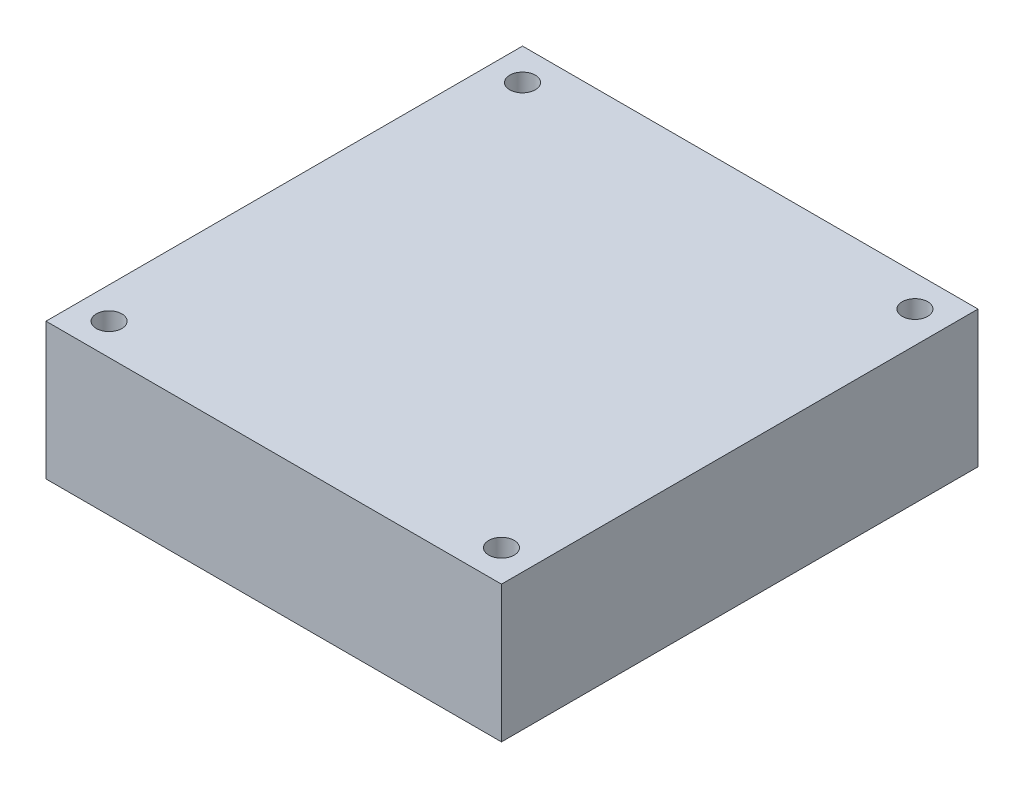
ISO-10303-21;
HEADER;
FILE_DESCRIPTION(('STEP AP214'),'2;1');
FILE_NAME('part.step','',(''),(''),'','','');
FILE_SCHEMA(('AUTOMOTIVE_DESIGN { 1 0 10303 214 1 1 1 1 }'));
ENDSEC;
DATA;
#1=APPLICATION_CONTEXT('core data for automotive mechanical design processes');
#2=APPLICATION_PROTOCOL_DEFINITION('international standard','automotive_design',2000,#1);
#3=PRODUCT_CONTEXT('',#1,'mechanical');
#4=PRODUCT('Part','Part','',(#3));
#5=PRODUCT_RELATED_PRODUCT_CATEGORY('part','',(#4));
#6=PRODUCT_DEFINITION_FORMATION('','',#4);
#7=PRODUCT_DEFINITION_CONTEXT('part definition',#1,'design');
#8=PRODUCT_DEFINITION('design','',#6,#7);
#9=PRODUCT_DEFINITION_SHAPE('','',#8);
#10=(LENGTH_UNIT() NAMED_UNIT(*) SI_UNIT(.MILLI.,.METRE.));
#11=(NAMED_UNIT(*) PLANE_ANGLE_UNIT() SI_UNIT($,.RADIAN.));
#12=(NAMED_UNIT(*) SI_UNIT($,.STERADIAN.) SOLID_ANGLE_UNIT());
#13=UNCERTAINTY_MEASURE_WITH_UNIT(LENGTH_MEASURE(1.E-05),#10,'distance_accuracy_value','');
#14=(GEOMETRIC_REPRESENTATION_CONTEXT(3) GLOBAL_UNCERTAINTY_ASSIGNED_CONTEXT((#13)) GLOBAL_UNIT_ASSIGNED_CONTEXT((#10,
#11,#12)) REPRESENTATION_CONTEXT('',''));
#15=CARTESIAN_POINT('',(0.,0.,0.));
#16=DIRECTION('',(0.,0.,1.));
#17=DIRECTION('',(1.,0.,0.));
#18=AXIS2_PLACEMENT_3D('',#15,#16,#17);
#19=CARTESIAN_POINT('',(32.5,19.5,-34.));
#20=DIRECTION('',(-1.,0.,0.));
#21=DIRECTION('',(0.,0.,1.));
#22=AXIS2_PLACEMENT_3D('',#19,#20,#21);
#23=PLANE('',#22);
#24=DIRECTION('',(0.,0.,-1.));
#25=VECTOR('',#24,1.);
#26=CARTESIAN_POINT('',(32.5,0.,-34.));
#27=LINE('',#26,#25);
#28=CARTESIAN_POINT('',(32.5,0.,34.));
#29=VERTEX_POINT('',#28);
#30=CARTESIAN_POINT('',(32.5,0.,-34.));
#31=VERTEX_POINT('',#30);
#32=EDGE_CURVE('E115',#29,#31,#27,.T.);
#33=ORIENTED_EDGE('',*,*,#32,.T.);
#34=DIRECTION('',(0.,-1.,0.));
#35=VECTOR('',#34,1.);
#36=CARTESIAN_POINT('',(32.5,19.5,-34.));
#37=LINE('',#36,#35);
#38=CARTESIAN_POINT('',(32.5,19.5,-34.));
#39=VERTEX_POINT('',#38);
#40=EDGE_CURVE('E11',#39,#31,#37,.T.);
#41=ORIENTED_EDGE('',*,*,#40,.F.);
#42=DIRECTION('',(0.,0.,-1.));
#43=VECTOR('',#42,1.);
#44=CARTESIAN_POINT('',(32.5,19.5,-34.));
#45=LINE('',#44,#43);
#46=CARTESIAN_POINT('',(32.5,19.5,34.));
#47=VERTEX_POINT('',#46);
#48=EDGE_CURVE('E99',#47,#39,#45,.T.);
#49=ORIENTED_EDGE('',*,*,#48,.F.);
#50=DIRECTION('',(0.,-1.,0.));
#51=VECTOR('',#50,1.);
#52=CARTESIAN_POINT('',(32.5,19.5,34.));
#53=LINE('',#52,#51);
#54=EDGE_CURVE('E111',#47,#29,#53,.T.);
#55=ORIENTED_EDGE('',*,*,#54,.T.);
#56=EDGE_LOOP('',(#33,#41,#49,#55));
#57=FACE_BOUND('',#56,.T.);
#58=ADVANCED_FACE('F47',(#57),#23,.F.);
#59=CARTESIAN_POINT('',(-32.5,19.5,-34.));
#60=DIRECTION('',(0.,0.,1.));
#61=DIRECTION('',(1.,0.,0.));
#62=AXIS2_PLACEMENT_3D('',#59,#60,#61);
#63=PLANE('',#62);
#64=DIRECTION('',(-1.,0.,0.));
#65=VECTOR('',#64,1.);
#66=CARTESIAN_POINT('',(-32.5,0.,-34.));
#67=LINE('',#66,#65);
#68=CARTESIAN_POINT('',(-32.5,0.,-34.));
#69=VERTEX_POINT('',#68);
#70=EDGE_CURVE('E104',#31,#69,#67,.T.);
#71=ORIENTED_EDGE('',*,*,#70,.T.);
#72=DIRECTION('',(0.,-1.,0.));
#73=VECTOR('',#72,1.);
#74=CARTESIAN_POINT('',(-32.5,19.5,-34.));
#75=LINE('',#74,#73);
#76=CARTESIAN_POINT('',(-32.5,19.5,-34.));
#77=VERTEX_POINT('',#76);
#78=EDGE_CURVE('E56',#77,#69,#75,.T.);
#79=ORIENTED_EDGE('',*,*,#78,.F.);
#80=DIRECTION('',(-1.,0.,0.));
#81=VECTOR('',#80,1.);
#82=CARTESIAN_POINT('',(-32.5,19.5,-34.));
#83=LINE('',#82,#81);
#84=EDGE_CURVE('E94',#39,#77,#83,.T.);
#85=ORIENTED_EDGE('',*,*,#84,.F.);
#86=ORIENTED_EDGE('',*,*,#40,.T.);
#87=EDGE_LOOP('',(#71,#79,#85,#86));
#88=FACE_BOUND('',#87,.T.);
#89=ADVANCED_FACE('F103',(#88),#63,.F.);
#90=CARTESIAN_POINT('',(-32.5,19.5,-34.));
#91=DIRECTION('',(1.,0.,0.));
#92=DIRECTION('',(0.,0.,-1.));
#93=AXIS2_PLACEMENT_3D('',#90,#91,#92);
#94=PLANE('',#93);
#95=DIRECTION('',(0.,0.,1.));
#96=VECTOR('',#95,1.);
#97=CARTESIAN_POINT('',(-32.5,0.,-34.));
#98=LINE('',#97,#96);
#99=CARTESIAN_POINT('',(-32.5,0.,34.));
#100=VERTEX_POINT('',#99);
#101=EDGE_CURVE('E81',#69,#100,#98,.T.);
#102=ORIENTED_EDGE('',*,*,#101,.T.);
#103=DIRECTION('',(0.,-1.,0.));
#104=VECTOR('',#103,1.);
#105=CARTESIAN_POINT('',(-32.5,19.5,34.));
#106=LINE('',#105,#104);
#107=CARTESIAN_POINT('',(-32.5,19.5,34.));
#108=VERTEX_POINT('',#107);
#109=EDGE_CURVE('E106',#108,#100,#106,.T.);
#110=ORIENTED_EDGE('',*,*,#109,.F.);
#111=DIRECTION('',(0.,0.,1.));
#112=VECTOR('',#111,1.);
#113=CARTESIAN_POINT('',(-32.5,19.5,-34.));
#114=LINE('',#113,#112);
#115=EDGE_CURVE('E97',#77,#108,#114,.T.);
#116=ORIENTED_EDGE('',*,*,#115,.F.);
#117=ORIENTED_EDGE('',*,*,#78,.T.);
#118=EDGE_LOOP('',(#102,#110,#116,#117));
#119=FACE_BOUND('',#118,.T.);
#120=ADVANCED_FACE('F107',(#119),#94,.F.);
#121=CARTESIAN_POINT('',(-32.5,19.5,34.));
#122=DIRECTION('',(0.,0.,-1.));
#123=DIRECTION('',(-1.,0.,0.));
#124=AXIS2_PLACEMENT_3D('',#121,#122,#123);
#125=PLANE('',#124);
#126=DIRECTION('',(1.,0.,0.));
#127=VECTOR('',#126,1.);
#128=CARTESIAN_POINT('',(-32.5,0.,34.));
#129=LINE('',#128,#127);
#130=EDGE_CURVE('E87',#100,#29,#129,.T.);
#131=ORIENTED_EDGE('',*,*,#130,.T.);
#132=ORIENTED_EDGE('',*,*,#54,.F.);
#133=DIRECTION('',(1.,0.,0.));
#134=VECTOR('',#133,1.);
#135=CARTESIAN_POINT('',(-32.5,19.5,34.));
#136=LINE('',#135,#134);
#137=EDGE_CURVE('E64',#108,#47,#136,.T.);
#138=ORIENTED_EDGE('',*,*,#137,.F.);
#139=ORIENTED_EDGE('',*,*,#109,.T.);
#140=EDGE_LOOP('',(#131,#132,#138,#139));
#141=FACE_BOUND('',#140,.T.);
#142=ADVANCED_FACE('F129',(#141),#125,.F.);
#143=CARTESIAN_POINT('',(0.,19.5,0.));
#144=DIRECTION('',(0.,1.,0.));
#145=DIRECTION('',(0.,0.,1.));
#146=AXIS2_PLACEMENT_3D('',#143,#144,#145);
#147=PLANE('',#146);
#148=CARTESIAN_POINT('',(-28.,19.5,29.5));
#149=DIRECTION('',(0.,1.,0.));
#150=DIRECTION('',(0.,0.,-1.));
#151=AXIS2_PLACEMENT_3D('',#148,#149,#150);
#152=CIRCLE('',#151,1.81972227692951);
#153=CARTESIAN_POINT('',(-28.,19.5,27.6802777230705));
#154=VERTEX_POINT('',#153);
#155=EDGE_CURVE('E140',#154,#154,#152,.T.);
#156=ORIENTED_EDGE('',*,*,#155,.F.);
#157=EDGE_LOOP('',(#156));
#158=FACE_BOUND('',#157,.T.);
#159=CARTESIAN_POINT('',(28.,19.5,-29.5));
#160=DIRECTION('',(0.,1.,0.));
#161=DIRECTION('',(0.,0.,-1.));
#162=AXIS2_PLACEMENT_3D('',#159,#160,#161);
#163=CIRCLE('',#162,1.81972227692951);
#164=CARTESIAN_POINT('',(28.,19.5,-31.3197222769295));
#165=VERTEX_POINT('',#164);
#166=EDGE_CURVE('E148',#165,#165,#163,.T.);
#167=ORIENTED_EDGE('',*,*,#166,.F.);
#168=EDGE_LOOP('',(#167));
#169=FACE_BOUND('',#168,.T.);
#170=CARTESIAN_POINT('',(-28.,19.5,-29.5));
#171=DIRECTION('',(0.,1.,0.));
#172=DIRECTION('',(0.,0.,1.));
#173=AXIS2_PLACEMENT_3D('',#170,#171,#172);
#174=CIRCLE('',#173,1.81972227692951);
#175=CARTESIAN_POINT('',(-28.,19.5,-27.6802777230705));
#176=VERTEX_POINT('',#175);
#177=EDGE_CURVE('E149',#176,#176,#174,.T.);
#178=ORIENTED_EDGE('',*,*,#177,.F.);
#179=EDGE_LOOP('',(#178));
#180=FACE_BOUND('',#179,.T.);
#181=CARTESIAN_POINT('',(28.,19.5,29.5));
#182=DIRECTION('',(0.,1.,0.));
#183=DIRECTION('',(0.,0.,1.));
#184=AXIS2_PLACEMENT_3D('',#181,#182,#183);
#185=CIRCLE('',#184,1.81972227692951);
#186=CARTESIAN_POINT('',(28.,19.5,31.3197222769295));
#187=VERTEX_POINT('',#186);
#188=EDGE_CURVE('E136',#187,#187,#185,.T.);
#189=ORIENTED_EDGE('',*,*,#188,.F.);
#190=EDGE_LOOP('',(#189));
#191=FACE_BOUND('',#190,.T.);
#192=ORIENTED_EDGE('',*,*,#48,.T.);
#193=ORIENTED_EDGE('',*,*,#84,.T.);
#194=ORIENTED_EDGE('',*,*,#115,.T.);
#195=ORIENTED_EDGE('',*,*,#137,.T.);
#196=EDGE_LOOP('',(#192,#193,#194,#195));
#197=FACE_BOUND('',#196,.T.);
#198=ADVANCED_FACE('F95',(#158,#169,#180,#191,#197),#147,.T.);
#199=CARTESIAN_POINT('',(0.,0.,0.));
#200=DIRECTION('',(0.,1.,0.));
#201=DIRECTION('',(0.,0.,1.));
#202=AXIS2_PLACEMENT_3D('',#199,#200,#201);
#203=PLANE('',#202);
#204=CARTESIAN_POINT('',(-28.,0.,29.5));
#205=DIRECTION('',(0.,1.,0.));
#206=DIRECTION('',(0.,0.,-1.));
#207=AXIS2_PLACEMENT_3D('',#204,#205,#206);
#208=CIRCLE('',#207,1.81972227692951);
#209=CARTESIAN_POINT('',(-28.,0.,27.6802777230705));
#210=VERTEX_POINT('',#209);
#211=EDGE_CURVE('E153',#210,#210,#208,.T.);
#212=ORIENTED_EDGE('',*,*,#211,.T.);
#213=EDGE_LOOP('',(#212));
#214=FACE_BOUND('',#213,.T.);
#215=CARTESIAN_POINT('',(28.,0.,-29.5));
#216=DIRECTION('',(0.,1.,0.));
#217=DIRECTION('',(0.,0.,-1.));
#218=AXIS2_PLACEMENT_3D('',#215,#216,#217);
#219=CIRCLE('',#218,1.81972227692951);
#220=CARTESIAN_POINT('',(28.,0.,-31.3197222769295));
#221=VERTEX_POINT('',#220);
#222=EDGE_CURVE('E144',#221,#221,#219,.T.);
#223=ORIENTED_EDGE('',*,*,#222,.T.);
#224=EDGE_LOOP('',(#223));
#225=FACE_BOUND('',#224,.T.);
#226=CARTESIAN_POINT('',(-28.,0.,-29.5));
#227=DIRECTION('',(0.,1.,0.));
#228=DIRECTION('',(0.,0.,1.));
#229=AXIS2_PLACEMENT_3D('',#226,#227,#228);
#230=CIRCLE('',#229,1.81972227692951);
#231=CARTESIAN_POINT('',(-28.,0.,-27.6802777230705));
#232=VERTEX_POINT('',#231);
#233=EDGE_CURVE('E160',#232,#232,#230,.T.);
#234=ORIENTED_EDGE('',*,*,#233,.T.);
#235=EDGE_LOOP('',(#234));
#236=FACE_BOUND('',#235,.T.);
#237=CARTESIAN_POINT('',(28.,0.,29.5));
#238=DIRECTION('',(0.,1.,0.));
#239=DIRECTION('',(0.,0.,1.));
#240=AXIS2_PLACEMENT_3D('',#237,#238,#239);
#241=CIRCLE('',#240,1.81972227692951);
#242=CARTESIAN_POINT('',(28.,0.,31.3197222769295));
#243=VERTEX_POINT('',#242);
#244=EDGE_CURVE('E119',#243,#243,#241,.T.);
#245=ORIENTED_EDGE('',*,*,#244,.T.);
#246=EDGE_LOOP('',(#245));
#247=FACE_BOUND('',#246,.T.);
#248=ORIENTED_EDGE('',*,*,#32,.F.);
#249=ORIENTED_EDGE('',*,*,#130,.F.);
#250=ORIENTED_EDGE('',*,*,#101,.F.);
#251=ORIENTED_EDGE('',*,*,#70,.F.);
#252=EDGE_LOOP('',(#248,#249,#250,#251));
#253=FACE_BOUND('',#252,.T.);
#254=ADVANCED_FACE('F132',(#214,#225,#236,#247,#253),#203,.F.);
#255=CARTESIAN_POINT('',(28.,0.,29.5));
#256=DIRECTION('',(0.,1.,0.));
#257=DIRECTION('',(0.,0.,1.));
#258=AXIS2_PLACEMENT_3D('',#255,#256,#257);
#259=CYLINDRICAL_SURFACE('',#258,1.81972227692951);
#260=ORIENTED_EDGE('',*,*,#244,.F.);
#261=EDGE_LOOP('',(#260));
#262=FACE_BOUND('',#261,.T.);
#263=ORIENTED_EDGE('',*,*,#188,.T.);
#264=EDGE_LOOP('',(#263));
#265=FACE_BOUND('',#264,.T.);
#266=ADVANCED_FACE('F176',(#262,#265),#259,.F.);
#267=CARTESIAN_POINT('',(-28.,0.,-29.5));
#268=DIRECTION('',(0.,1.,0.));
#269=DIRECTION('',(0.,0.,1.));
#270=AXIS2_PLACEMENT_3D('',#267,#268,#269);
#271=CYLINDRICAL_SURFACE('',#270,1.81972227692951);
#272=ORIENTED_EDGE('',*,*,#233,.F.);
#273=EDGE_LOOP('',(#272));
#274=FACE_BOUND('',#273,.T.);
#275=ORIENTED_EDGE('',*,*,#177,.T.);
#276=EDGE_LOOP('',(#275));
#277=FACE_BOUND('',#276,.T.);
#278=ADVANCED_FACE('F168',(#274,#277),#271,.F.);
#279=CARTESIAN_POINT('',(28.,0.,-29.5));
#280=DIRECTION('',(0.,1.,0.));
#281=DIRECTION('',(0.,0.,1.));
#282=AXIS2_PLACEMENT_3D('',#279,#280,#281);
#283=CYLINDRICAL_SURFACE('',#282,1.81972227692951);
#284=ORIENTED_EDGE('',*,*,#222,.F.);
#285=EDGE_LOOP('',(#284));
#286=FACE_BOUND('',#285,.T.);
#287=ORIENTED_EDGE('',*,*,#166,.T.);
#288=EDGE_LOOP('',(#287));
#289=FACE_BOUND('',#288,.T.);
#290=ADVANCED_FACE('F184',(#286,#289),#283,.F.);
#291=CARTESIAN_POINT('',(-28.,0.,29.5));
#292=DIRECTION('',(0.,1.,0.));
#293=DIRECTION('',(0.,0.,1.));
#294=AXIS2_PLACEMENT_3D('',#291,#292,#293);
#295=CYLINDRICAL_SURFACE('',#294,1.81972227692951);
#296=ORIENTED_EDGE('',*,*,#211,.F.);
#297=EDGE_LOOP('',(#296));
#298=FACE_BOUND('',#297,.T.);
#299=ORIENTED_EDGE('',*,*,#155,.T.);
#300=EDGE_LOOP('',(#299));
#301=FACE_BOUND('',#300,.T.);
#302=ADVANCED_FACE('F235',(#298,#301),#295,.F.);
#303=CLOSED_SHELL('',(#58,#89,#120,#142,#198,#254,#266,#278,#290,#302));
#304=MANIFOLD_SOLID_BREP('B2',#303);
#305=ADVANCED_BREP_SHAPE_REPRESENTATION('',(#18,#304),#14);
#306=SHAPE_DEFINITION_REPRESENTATION(#9,#305);
ENDSEC;
END-ISO-10303-21;
